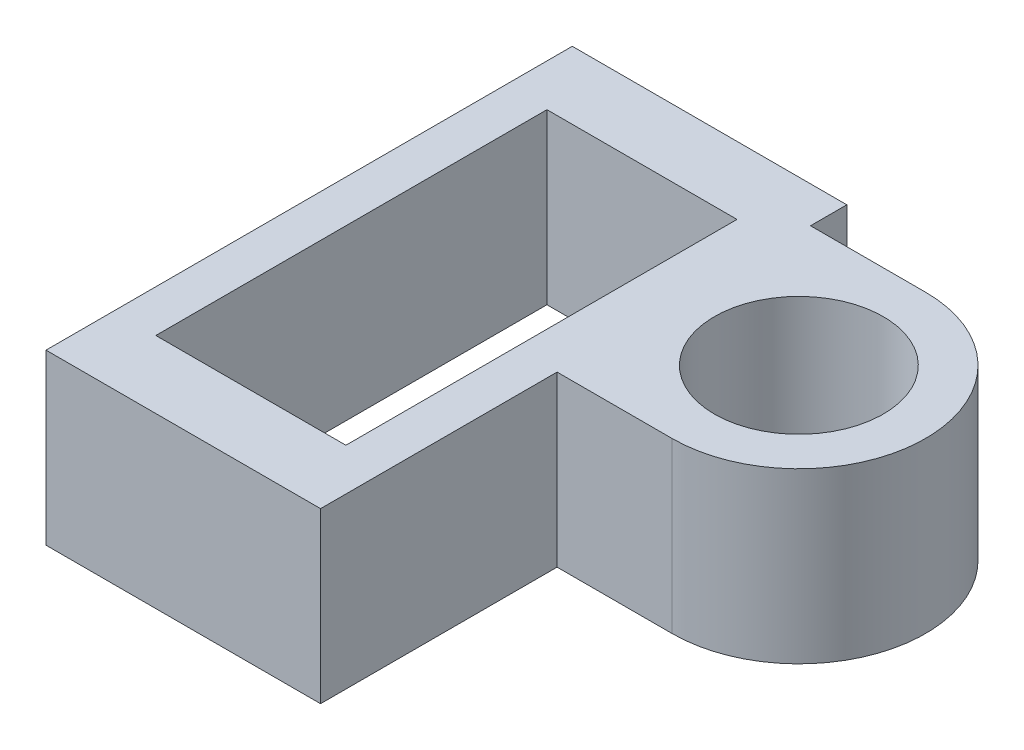
ISO-10303-21;
HEADER;
FILE_DESCRIPTION(('STEP AP214'),'2;1');
FILE_NAME('part.step','',(''),(''),'','','');
FILE_SCHEMA(('AUTOMOTIVE_DESIGN { 1 0 10303 214 1 1 1 1 }'));
ENDSEC;
DATA;
#1=APPLICATION_CONTEXT('core data for automotive mechanical design processes');
#2=APPLICATION_PROTOCOL_DEFINITION('international standard','automotive_design',2000,#1);
#3=PRODUCT_CONTEXT('',#1,'mechanical');
#4=PRODUCT('Part','Part','',(#3));
#5=PRODUCT_RELATED_PRODUCT_CATEGORY('part','',(#4));
#6=PRODUCT_DEFINITION_FORMATION('','',#4);
#7=PRODUCT_DEFINITION_CONTEXT('part definition',#1,'design');
#8=PRODUCT_DEFINITION('design','',#6,#7);
#9=PRODUCT_DEFINITION_SHAPE('','',#8);
#10=(LENGTH_UNIT() NAMED_UNIT(*) SI_UNIT(.MILLI.,.METRE.));
#11=(NAMED_UNIT(*) PLANE_ANGLE_UNIT() SI_UNIT($,.RADIAN.));
#12=(NAMED_UNIT(*) SI_UNIT($,.STERADIAN.) SOLID_ANGLE_UNIT());
#13=UNCERTAINTY_MEASURE_WITH_UNIT(LENGTH_MEASURE(1.E-05),#10,'distance_accuracy_value','');
#14=(GEOMETRIC_REPRESENTATION_CONTEXT(3) GLOBAL_UNCERTAINTY_ASSIGNED_CONTEXT((#13)) GLOBAL_UNIT_ASSIGNED_CONTEXT((#10,
#11,#12)) REPRESENTATION_CONTEXT('',''));
#15=CARTESIAN_POINT('',(0.,0.,0.));
#16=DIRECTION('',(0.,0.,1.));
#17=DIRECTION('',(1.,0.,0.));
#18=AXIS2_PLACEMENT_3D('',#15,#16,#17);
#19=CARTESIAN_POINT('',(0.,25.4,0.));
#20=DIRECTION('',(0.,1.,0.));
#21=DIRECTION('',(0.,0.,1.));
#22=AXIS2_PLACEMENT_3D('',#19,#20,#21);
#23=PLANE('',#22);
#24=DIRECTION('',(0.,0.,1.));
#25=VECTOR('',#24,1.);
#26=CARTESIAN_POINT('',(-40.7924,25.4,0.));
#27=LINE('',#26,#25);
#28=CARTESIAN_POINT('',(-40.7924,25.4,-35.56));
#29=VERTEX_POINT('',#28);
#30=CARTESIAN_POINT('',(-40.7924,25.4,0.));
#31=VERTEX_POINT('',#30);
#32=EDGE_CURVE('E47',#29,#31,#27,.T.);
#33=ORIENTED_EDGE('',*,*,#32,.F.);
#34=DIRECTION('',(-1.,0.,0.));
#35=VECTOR('',#34,1.);
#36=CARTESIAN_POINT('',(-40.7924,25.4,-35.56));
#37=LINE('',#36,#35);
#38=CARTESIAN_POINT('',(-23.495,25.4,-35.56));
#39=VERTEX_POINT('',#38);
#40=EDGE_CURVE('E185',#39,#29,#37,.T.);
#41=ORIENTED_EDGE('',*,*,#40,.F.);
#42=CARTESIAN_POINT('',(-23.495,25.4,-54.61));
#43=DIRECTION('',(0.,-1.,0.));
#44=DIRECTION('',(0.,0.,-1.));
#45=AXIS2_PLACEMENT_3D('',#42,#43,#44);
#46=CIRCLE('',#45,19.05);
#47=CARTESIAN_POINT('',(-23.495,25.4,-73.66));
#48=VERTEX_POINT('',#47);
#49=EDGE_CURVE('E182',#48,#39,#46,.T.);
#50=ORIENTED_EDGE('',*,*,#49,.F.);
#51=DIRECTION('',(1.,0.,0.));
#52=VECTOR('',#51,1.);
#53=CARTESIAN_POINT('',(-40.7924,25.4,-73.66));
#54=LINE('',#53,#52);
#55=CARTESIAN_POINT('',(-40.7924,25.4,-73.66));
#56=VERTEX_POINT('',#55);
#57=EDGE_CURVE('E139',#56,#48,#54,.T.);
#58=ORIENTED_EDGE('',*,*,#57,.F.);
#59=DIRECTION('',(0.,0.,1.));
#60=VECTOR('',#59,1.);
#61=CARTESIAN_POINT('',(-40.7924,25.4,-79.121));
#62=LINE('',#61,#60);
#63=CARTESIAN_POINT('',(-40.7924,25.4,-79.121));
#64=VERTEX_POINT('',#63);
#65=EDGE_CURVE('E124',#64,#56,#62,.T.);
#66=ORIENTED_EDGE('',*,*,#65,.F.);
#67=DIRECTION('',(-1.,0.,0.));
#68=VECTOR('',#67,1.);
#69=CARTESIAN_POINT('',(0.,25.4,-79.121));
#70=LINE('',#69,#68);
#71=CARTESIAN_POINT('',(-82.0674,25.4,-79.121));
#72=VERTEX_POINT('',#71);
#73=EDGE_CURVE('E135',#64,#72,#70,.T.);
#74=ORIENTED_EDGE('',*,*,#73,.T.);
#75=DIRECTION('',(0.,0.,1.));
#76=VECTOR('',#75,1.);
#77=CARTESIAN_POINT('',(-82.0674,25.4,0.));
#78=LINE('',#77,#76);
#79=CARTESIAN_POINT('',(-82.0674,25.4,0.));
#80=VERTEX_POINT('',#79);
#81=EDGE_CURVE('E143',#72,#80,#78,.T.);
#82=ORIENTED_EDGE('',*,*,#81,.T.);
#83=DIRECTION('',(1.,0.,0.));
#84=VECTOR('',#83,1.);
#85=CARTESIAN_POINT('',(0.,25.4,0.));
#86=LINE('',#85,#84);
#87=EDGE_CURVE('E146',#80,#31,#86,.T.);
#88=ORIENTED_EDGE('',*,*,#87,.T.);
#89=EDGE_LOOP('',(#33,#41,#50,#58,#66,#74,#82,#88));
#90=FACE_BOUND('',#89,.T.);
#91=DIRECTION('',(1.,0.,0.));
#92=VECTOR('',#91,1.);
#93=CARTESIAN_POINT('',(-75.7174,25.4,-10.16));
#94=LINE('',#93,#92);
#95=CARTESIAN_POINT('',(-75.7174,25.4,-10.16));
#96=VERTEX_POINT('',#95);
#97=CARTESIAN_POINT('',(-47.1424,25.4,-10.16));
#98=VERTEX_POINT('',#97);
#99=EDGE_CURVE('E207',#96,#98,#94,.T.);
#100=ORIENTED_EDGE('',*,*,#99,.F.);
#101=DIRECTION('',(0.,0.,1.));
#102=VECTOR('',#101,1.);
#103=CARTESIAN_POINT('',(-75.7174,25.4,-68.961));
#104=LINE('',#103,#102);
#105=CARTESIAN_POINT('',(-75.7174,25.4,-68.961));
#106=VERTEX_POINT('',#105);
#107=EDGE_CURVE('E205',#106,#96,#104,.T.);
#108=ORIENTED_EDGE('',*,*,#107,.F.);
#109=DIRECTION('',(-1.,0.,0.));
#110=VECTOR('',#109,1.);
#111=CARTESIAN_POINT('',(-75.7174,25.4,-68.961));
#112=LINE('',#111,#110);
#113=CARTESIAN_POINT('',(-47.1424,25.4,-68.961));
#114=VERTEX_POINT('',#113);
#115=EDGE_CURVE('E212',#114,#106,#112,.T.);
#116=ORIENTED_EDGE('',*,*,#115,.F.);
#117=DIRECTION('',(0.,0.,-1.));
#118=VECTOR('',#117,1.);
#119=CARTESIAN_POINT('',(-47.1424,25.4,-68.961));
#120=LINE('',#119,#118);
#121=EDGE_CURVE('E210',#98,#114,#120,.T.);
#122=ORIENTED_EDGE('',*,*,#121,.F.);
#123=EDGE_LOOP('',(#100,#108,#116,#122));
#124=FACE_BOUND('',#123,.T.);
#125=CARTESIAN_POINT('',(-23.495,25.4,-54.61));
#126=DIRECTION('',(0.,1.,0.));
#127=DIRECTION('',(0.,0.,1.));
#128=AXIS2_PLACEMENT_3D('',#125,#126,#127);
#129=CIRCLE('',#128,12.7);
#130=CARTESIAN_POINT('',(-23.495,25.4,-41.91));
#131=VERTEX_POINT('',#130);
#132=EDGE_CURVE('E199',#131,#131,#129,.T.);
#133=ORIENTED_EDGE('',*,*,#132,.F.);
#134=EDGE_LOOP('',(#133));
#135=FACE_BOUND('',#134,.T.);
#136=ADVANCED_FACE('F32',(#90,#124,#135),#23,.T.);
#137=CARTESIAN_POINT('',(0.,0.,0.));
#138=DIRECTION('',(0.,1.,0.));
#139=DIRECTION('',(0.,0.,1.));
#140=AXIS2_PLACEMENT_3D('',#137,#138,#139);
#141=PLANE('',#140);
#142=DIRECTION('',(0.,0.,1.));
#143=VECTOR('',#142,1.);
#144=CARTESIAN_POINT('',(-75.7174,0.,-68.961));
#145=LINE('',#144,#143);
#146=CARTESIAN_POINT('',(-75.7174,0.,-68.961));
#147=VERTEX_POINT('',#146);
#148=CARTESIAN_POINT('',(-75.7174,0.,-10.16));
#149=VERTEX_POINT('',#148);
#150=EDGE_CURVE('E202',#147,#149,#145,.T.);
#151=ORIENTED_EDGE('',*,*,#150,.T.);
#152=DIRECTION('',(1.,0.,0.));
#153=VECTOR('',#152,1.);
#154=CARTESIAN_POINT('',(-75.7174,0.,-10.16));
#155=LINE('',#154,#153);
#156=CARTESIAN_POINT('',(-47.1424,0.,-10.16));
#157=VERTEX_POINT('',#156);
#158=EDGE_CURVE('E217',#149,#157,#155,.T.);
#159=ORIENTED_EDGE('',*,*,#158,.T.);
#160=DIRECTION('',(0.,0.,-1.));
#161=VECTOR('',#160,1.);
#162=CARTESIAN_POINT('',(-47.1424,0.,-68.961));
#163=LINE('',#162,#161);
#164=CARTESIAN_POINT('',(-47.1424,0.,-68.961));
#165=VERTEX_POINT('',#164);
#166=EDGE_CURVE('E220',#157,#165,#163,.T.);
#167=ORIENTED_EDGE('',*,*,#166,.T.);
#168=DIRECTION('',(-1.,0.,0.));
#169=VECTOR('',#168,1.);
#170=CARTESIAN_POINT('',(-75.7174,0.,-68.961));
#171=LINE('',#170,#169);
#172=EDGE_CURVE('E208',#165,#147,#171,.T.);
#173=ORIENTED_EDGE('',*,*,#172,.T.);
#174=EDGE_LOOP('',(#151,#159,#167,#173));
#175=FACE_BOUND('',#174,.T.);
#176=DIRECTION('',(1.,0.,0.));
#177=VECTOR('',#176,1.);
#178=CARTESIAN_POINT('',(-40.7924,0.,-35.56));
#179=LINE('',#178,#177);
#180=CARTESIAN_POINT('',(-40.7924,0.,-35.56));
#181=VERTEX_POINT('',#180);
#182=CARTESIAN_POINT('',(-23.495,0.,-35.56));
#183=VERTEX_POINT('',#182);
#184=EDGE_CURVE('E175',#181,#183,#179,.T.);
#185=ORIENTED_EDGE('',*,*,#184,.F.);
#186=DIRECTION('',(0.,0.,-1.));
#187=VECTOR('',#186,1.);
#188=CARTESIAN_POINT('',(-40.7924,0.,0.));
#189=LINE('',#188,#187);
#190=CARTESIAN_POINT('',(-40.7924,0.,0.));
#191=VERTEX_POINT('',#190);
#192=EDGE_CURVE('E140',#191,#181,#189,.T.);
#193=ORIENTED_EDGE('',*,*,#192,.F.);
#194=DIRECTION('',(1.,0.,0.));
#195=VECTOR('',#194,1.);
#196=CARTESIAN_POINT('',(0.,0.,0.));
#197=LINE('',#196,#195);
#198=CARTESIAN_POINT('',(-82.0674,0.,0.));
#199=VERTEX_POINT('',#198);
#200=EDGE_CURVE('E144',#199,#191,#197,.T.);
#201=ORIENTED_EDGE('',*,*,#200,.F.);
#202=DIRECTION('',(0.,0.,1.));
#203=VECTOR('',#202,1.);
#204=CARTESIAN_POINT('',(-82.0674,0.,0.));
#205=LINE('',#204,#203);
#206=CARTESIAN_POINT('',(-82.0674,0.,-79.121));
#207=VERTEX_POINT('',#206);
#208=EDGE_CURVE('E149',#207,#199,#205,.T.);
#209=ORIENTED_EDGE('',*,*,#208,.F.);
#210=DIRECTION('',(-1.,0.,0.));
#211=VECTOR('',#210,1.);
#212=CARTESIAN_POINT('',(0.,0.,-79.121));
#213=LINE('',#212,#211);
#214=CARTESIAN_POINT('',(-40.7924,0.,-79.121));
#215=VERTEX_POINT('',#214);
#216=EDGE_CURVE('E157',#215,#207,#213,.T.);
#217=ORIENTED_EDGE('',*,*,#216,.F.);
#218=DIRECTION('',(0.,0.,-1.));
#219=VECTOR('',#218,1.);
#220=CARTESIAN_POINT('',(-40.7924,0.,-79.121));
#221=LINE('',#220,#219);
#222=CARTESIAN_POINT('',(-40.7924,0.,-73.66));
#223=VERTEX_POINT('',#222);
#224=EDGE_CURVE('E127',#223,#215,#221,.T.);
#225=ORIENTED_EDGE('',*,*,#224,.F.);
#226=DIRECTION('',(-1.,0.,0.));
#227=VECTOR('',#226,1.);
#228=CARTESIAN_POINT('',(-40.7924,0.,-73.66));
#229=LINE('',#228,#227);
#230=CARTESIAN_POINT('',(-23.495,0.,-73.66));
#231=VERTEX_POINT('',#230);
#232=EDGE_CURVE('E282',#231,#223,#229,.T.);
#233=ORIENTED_EDGE('',*,*,#232,.F.);
#234=CARTESIAN_POINT('',(-23.495,0.,-54.61));
#235=DIRECTION('',(0.,1.,0.));
#236=DIRECTION('',(0.,0.,1.));
#237=AXIS2_PLACEMENT_3D('',#234,#235,#236);
#238=CIRCLE('',#237,19.05);
#239=EDGE_CURVE('E177',#183,#231,#238,.T.);
#240=ORIENTED_EDGE('',*,*,#239,.F.);
#241=EDGE_LOOP('',(#185,#193,#201,#209,#217,#225,#233,#240));
#242=FACE_BOUND('',#241,.T.);
#243=CARTESIAN_POINT('',(-23.495,0.,-54.61));
#244=DIRECTION('',(0.,1.,0.));
#245=DIRECTION('',(0.,0.,1.));
#246=AXIS2_PLACEMENT_3D('',#243,#244,#245);
#247=CIRCLE('',#246,12.7);
#248=CARTESIAN_POINT('',(-23.495,0.,-41.91));
#249=VERTEX_POINT('',#248);
#250=EDGE_CURVE('E191',#249,#249,#247,.T.);
#251=ORIENTED_EDGE('',*,*,#250,.T.);
#252=EDGE_LOOP('',(#251));
#253=FACE_BOUND('',#252,.T.);
#254=ADVANCED_FACE('F170',(#175,#242,#253),#141,.F.);
#255=CARTESIAN_POINT('',(0.,25.4,-79.121));
#256=DIRECTION('',(0.,0.,1.));
#257=DIRECTION('',(1.,0.,0.));
#258=AXIS2_PLACEMENT_3D('',#255,#256,#257);
#259=PLANE('',#258);
#260=ORIENTED_EDGE('',*,*,#73,.F.);
#261=DIRECTION('',(0.,1.,0.));
#262=VECTOR('',#261,1.);
#263=CARTESIAN_POINT('',(-40.7924,-0.001000000000001,-79.121));
#264=LINE('',#263,#262);
#265=EDGE_CURVE('E121',#215,#64,#264,.T.);
#266=ORIENTED_EDGE('',*,*,#265,.F.);
#267=ORIENTED_EDGE('',*,*,#216,.T.);
#268=DIRECTION('',(0.,-1.,0.));
#269=VECTOR('',#268,1.);
#270=CARTESIAN_POINT('',(-82.0674,25.4,-79.121));
#271=LINE('',#270,#269);
#272=EDGE_CURVE('E11',#72,#207,#271,.T.);
#273=ORIENTED_EDGE('',*,*,#272,.F.);
#274=EDGE_LOOP('',(#260,#266,#267,#273));
#275=FACE_BOUND('',#274,.T.);
#276=ADVANCED_FACE('F34',(#275),#259,.F.);
#277=CARTESIAN_POINT('',(-82.0674,25.4,0.));
#278=DIRECTION('',(1.,0.,0.));
#279=DIRECTION('',(0.,0.,-1.));
#280=AXIS2_PLACEMENT_3D('',#277,#278,#279);
#281=PLANE('',#280);
#282=ORIENTED_EDGE('',*,*,#208,.T.);
#283=DIRECTION('',(0.,-1.,0.));
#284=VECTOR('',#283,1.);
#285=CARTESIAN_POINT('',(-82.0674,25.4,0.));
#286=LINE('',#285,#284);
#287=EDGE_CURVE('E40',#80,#199,#286,.T.);
#288=ORIENTED_EDGE('',*,*,#287,.F.);
#289=ORIENTED_EDGE('',*,*,#81,.F.);
#290=ORIENTED_EDGE('',*,*,#272,.T.);
#291=EDGE_LOOP('',(#282,#288,#289,#290));
#292=FACE_BOUND('',#291,.T.);
#293=ADVANCED_FACE('F265',(#292),#281,.F.);
#294=CARTESIAN_POINT('',(0.,25.4,0.));
#295=DIRECTION('',(0.,0.,-1.));
#296=DIRECTION('',(-1.,0.,0.));
#297=AXIS2_PLACEMENT_3D('',#294,#295,#296);
#298=PLANE('',#297);
#299=ORIENTED_EDGE('',*,*,#200,.T.);
#300=DIRECTION('',(0.,1.,0.));
#301=VECTOR('',#300,1.);
#302=CARTESIAN_POINT('',(-40.7924,-0.001000000000001,0.));
#303=LINE('',#302,#301);
#304=EDGE_CURVE('E189',#191,#31,#303,.T.);
#305=ORIENTED_EDGE('',*,*,#304,.T.);
#306=ORIENTED_EDGE('',*,*,#87,.F.);
#307=ORIENTED_EDGE('',*,*,#287,.T.);
#308=EDGE_LOOP('',(#299,#305,#306,#307));
#309=FACE_BOUND('',#308,.T.);
#310=ADVANCED_FACE('F164',(#309),#298,.F.);
#311=CARTESIAN_POINT('',(-75.7174,25.4,-68.961));
#312=DIRECTION('',(1.,0.,0.));
#313=DIRECTION('',(0.,0.,-1.));
#314=AXIS2_PLACEMENT_3D('',#311,#312,#313);
#315=PLANE('',#314);
#316=ORIENTED_EDGE('',*,*,#150,.F.);
#317=DIRECTION('',(0.,-1.,0.));
#318=VECTOR('',#317,1.);
#319=CARTESIAN_POINT('',(-75.7174,25.4,-68.961));
#320=LINE('',#319,#318);
#321=EDGE_CURVE('E214',#106,#147,#320,.T.);
#322=ORIENTED_EDGE('',*,*,#321,.F.);
#323=ORIENTED_EDGE('',*,*,#107,.T.);
#324=DIRECTION('',(0.,-1.,0.));
#325=VECTOR('',#324,1.);
#326=CARTESIAN_POINT('',(-75.7174,25.4,-10.16));
#327=LINE('',#326,#325);
#328=EDGE_CURVE('E152',#96,#149,#327,.T.);
#329=ORIENTED_EDGE('',*,*,#328,.T.);
#330=EDGE_LOOP('',(#316,#322,#323,#329));
#331=FACE_BOUND('',#330,.T.);
#332=ADVANCED_FACE('F234',(#331),#315,.T.);
#333=CARTESIAN_POINT('',(-75.7174,25.4,-10.16));
#334=DIRECTION('',(0.,0.,-1.));
#335=DIRECTION('',(-1.,0.,0.));
#336=AXIS2_PLACEMENT_3D('',#333,#334,#335);
#337=PLANE('',#336);
#338=ORIENTED_EDGE('',*,*,#158,.F.);
#339=ORIENTED_EDGE('',*,*,#328,.F.);
#340=ORIENTED_EDGE('',*,*,#99,.T.);
#341=DIRECTION('',(0.,-1.,0.));
#342=VECTOR('',#341,1.);
#343=CARTESIAN_POINT('',(-47.1424,25.4,-10.16));
#344=LINE('',#343,#342);
#345=EDGE_CURVE('E227',#98,#157,#344,.T.);
#346=ORIENTED_EDGE('',*,*,#345,.T.);
#347=EDGE_LOOP('',(#338,#339,#340,#346));
#348=FACE_BOUND('',#347,.T.);
#349=ADVANCED_FACE('F243',(#348),#337,.T.);
#350=CARTESIAN_POINT('',(-47.1424,25.4,-68.961));
#351=DIRECTION('',(-1.,0.,0.));
#352=DIRECTION('',(0.,0.,1.));
#353=AXIS2_PLACEMENT_3D('',#350,#351,#352);
#354=PLANE('',#353);
#355=ORIENTED_EDGE('',*,*,#166,.F.);
#356=ORIENTED_EDGE('',*,*,#345,.F.);
#357=ORIENTED_EDGE('',*,*,#121,.T.);
#358=DIRECTION('',(0.,-1.,0.));
#359=VECTOR('',#358,1.);
#360=CARTESIAN_POINT('',(-47.1424,25.4,-68.961));
#361=LINE('',#360,#359);
#362=EDGE_CURVE('E55',#114,#165,#361,.T.);
#363=ORIENTED_EDGE('',*,*,#362,.T.);
#364=EDGE_LOOP('',(#355,#356,#357,#363));
#365=FACE_BOUND('',#364,.T.);
#366=ADVANCED_FACE('F245',(#365),#354,.T.);
#367=CARTESIAN_POINT('',(-75.7174,25.4,-68.961));
#368=DIRECTION('',(0.,0.,1.));
#369=DIRECTION('',(1.,0.,0.));
#370=AXIS2_PLACEMENT_3D('',#367,#368,#369);
#371=PLANE('',#370);
#372=ORIENTED_EDGE('',*,*,#172,.F.);
#373=ORIENTED_EDGE('',*,*,#362,.F.);
#374=ORIENTED_EDGE('',*,*,#115,.T.);
#375=ORIENTED_EDGE('',*,*,#321,.T.);
#376=EDGE_LOOP('',(#372,#373,#374,#375));
#377=FACE_BOUND('',#376,.T.);
#378=ADVANCED_FACE('F239',(#377),#371,.T.);
#379=CARTESIAN_POINT('',(-23.495,25.4,-54.61));
#380=DIRECTION('',(0.,-1.,0.));
#381=DIRECTION('',(0.,0.,-1.));
#382=AXIS2_PLACEMENT_3D('',#379,#380,#381);
#383=CYLINDRICAL_SURFACE('',#382,12.7);
#384=ORIENTED_EDGE('',*,*,#132,.T.);
#385=EDGE_LOOP('',(#384));
#386=FACE_BOUND('',#385,.T.);
#387=ORIENTED_EDGE('',*,*,#250,.F.);
#388=EDGE_LOOP('',(#387));
#389=FACE_BOUND('',#388,.T.);
#390=ADVANCED_FACE('F252',(#386,#389),#383,.F.);
#391=CARTESIAN_POINT('',(-40.7924,-0.001000000000001,0.));
#392=DIRECTION('',(-1.,0.,0.));
#393=DIRECTION('',(0.,0.,1.));
#394=AXIS2_PLACEMENT_3D('',#391,#392,#393);
#395=PLANE('',#394);
#396=ORIENTED_EDGE('',*,*,#192,.T.);
#397=DIRECTION('',(0.,1.,0.));
#398=VECTOR('',#397,1.);
#399=CARTESIAN_POINT('',(-40.7924,-0.001000000000001,-35.56));
#400=LINE('',#399,#398);
#401=EDGE_CURVE('E192',#181,#29,#400,.T.);
#402=ORIENTED_EDGE('',*,*,#401,.T.);
#403=ORIENTED_EDGE('',*,*,#32,.T.);
#404=ORIENTED_EDGE('',*,*,#304,.F.);
#405=EDGE_LOOP('',(#396,#402,#403,#404));
#406=FACE_BOUND('',#405,.T.);
#407=ADVANCED_FACE('F296',(#406),#395,.F.);
#408=CARTESIAN_POINT('',(-40.7924,-0.001000000000001,-35.56));
#409=DIRECTION('',(0.,0.,-1.));
#410=DIRECTION('',(-1.,0.,0.));
#411=AXIS2_PLACEMENT_3D('',#408,#409,#410);
#412=PLANE('',#411);
#413=ORIENTED_EDGE('',*,*,#184,.T.);
#414=DIRECTION('',(0.,1.,0.));
#415=VECTOR('',#414,1.);
#416=CARTESIAN_POINT('',(-23.495,-0.001000000000001,-35.56));
#417=LINE('',#416,#415);
#418=EDGE_CURVE('E194',#183,#39,#417,.T.);
#419=ORIENTED_EDGE('',*,*,#418,.T.);
#420=ORIENTED_EDGE('',*,*,#40,.T.);
#421=ORIENTED_EDGE('',*,*,#401,.F.);
#422=EDGE_LOOP('',(#413,#419,#420,#421));
#423=FACE_BOUND('',#422,.T.);
#424=ADVANCED_FACE('F274',(#423),#412,.F.);
#425=CARTESIAN_POINT('',(-23.495,-0.001000000000001,-54.61));
#426=DIRECTION('',(0.,1.,0.));
#427=DIRECTION('',(0.,0.,1.));
#428=AXIS2_PLACEMENT_3D('',#425,#426,#427);
#429=CYLINDRICAL_SURFACE('',#428,19.05);
#430=ORIENTED_EDGE('',*,*,#239,.T.);
#431=DIRECTION('',(0.,1.,0.));
#432=VECTOR('',#431,1.);
#433=CARTESIAN_POINT('',(-23.495,-0.001000000000001,-73.66));
#434=LINE('',#433,#432);
#435=EDGE_CURVE('E196',#231,#48,#434,.T.);
#436=ORIENTED_EDGE('',*,*,#435,.T.);
#437=ORIENTED_EDGE('',*,*,#49,.T.);
#438=ORIENTED_EDGE('',*,*,#418,.F.);
#439=EDGE_LOOP('',(#430,#436,#437,#438));
#440=FACE_BOUND('',#439,.T.);
#441=ADVANCED_FACE('F277',(#440),#429,.T.);
#442=CARTESIAN_POINT('',(-40.7924,-0.001000000000001,-73.66));
#443=DIRECTION('',(0.,0.,1.));
#444=DIRECTION('',(1.,0.,0.));
#445=AXIS2_PLACEMENT_3D('',#442,#443,#444);
#446=PLANE('',#445);
#447=ORIENTED_EDGE('',*,*,#232,.T.);
#448=DIRECTION('',(0.,1.,0.));
#449=VECTOR('',#448,1.);
#450=CARTESIAN_POINT('',(-40.7924,-0.001000000000001,-73.66));
#451=LINE('',#450,#449);
#452=EDGE_CURVE('E131',#223,#56,#451,.T.);
#453=ORIENTED_EDGE('',*,*,#452,.T.);
#454=ORIENTED_EDGE('',*,*,#57,.T.);
#455=ORIENTED_EDGE('',*,*,#435,.F.);
#456=EDGE_LOOP('',(#447,#453,#454,#455));
#457=FACE_BOUND('',#456,.T.);
#458=ADVANCED_FACE('F281',(#457),#446,.F.);
#459=CARTESIAN_POINT('',(-40.7924,-0.001000000000001,-79.121));
#460=DIRECTION('',(-1.,0.,0.));
#461=DIRECTION('',(0.,0.,1.));
#462=AXIS2_PLACEMENT_3D('',#459,#460,#461);
#463=PLANE('',#462);
#464=ORIENTED_EDGE('',*,*,#224,.T.);
#465=ORIENTED_EDGE('',*,*,#265,.T.);
#466=ORIENTED_EDGE('',*,*,#65,.T.);
#467=ORIENTED_EDGE('',*,*,#452,.F.);
#468=EDGE_LOOP('',(#464,#465,#466,#467));
#469=FACE_BOUND('',#468,.T.);
#470=ADVANCED_FACE('F123',(#469),#463,.F.);
#471=CLOSED_SHELL('',(#136,#254,#276,#293,#310,#332,#349,#366,#378,#390,#407,#424,#441,#458,#470));
#472=MANIFOLD_SOLID_BREP('B2',#471);
#473=ADVANCED_BREP_SHAPE_REPRESENTATION('',(#18,#472),#14);
#474=SHAPE_DEFINITION_REPRESENTATION(#9,#473);
ENDSEC;
END-ISO-10303-21;
